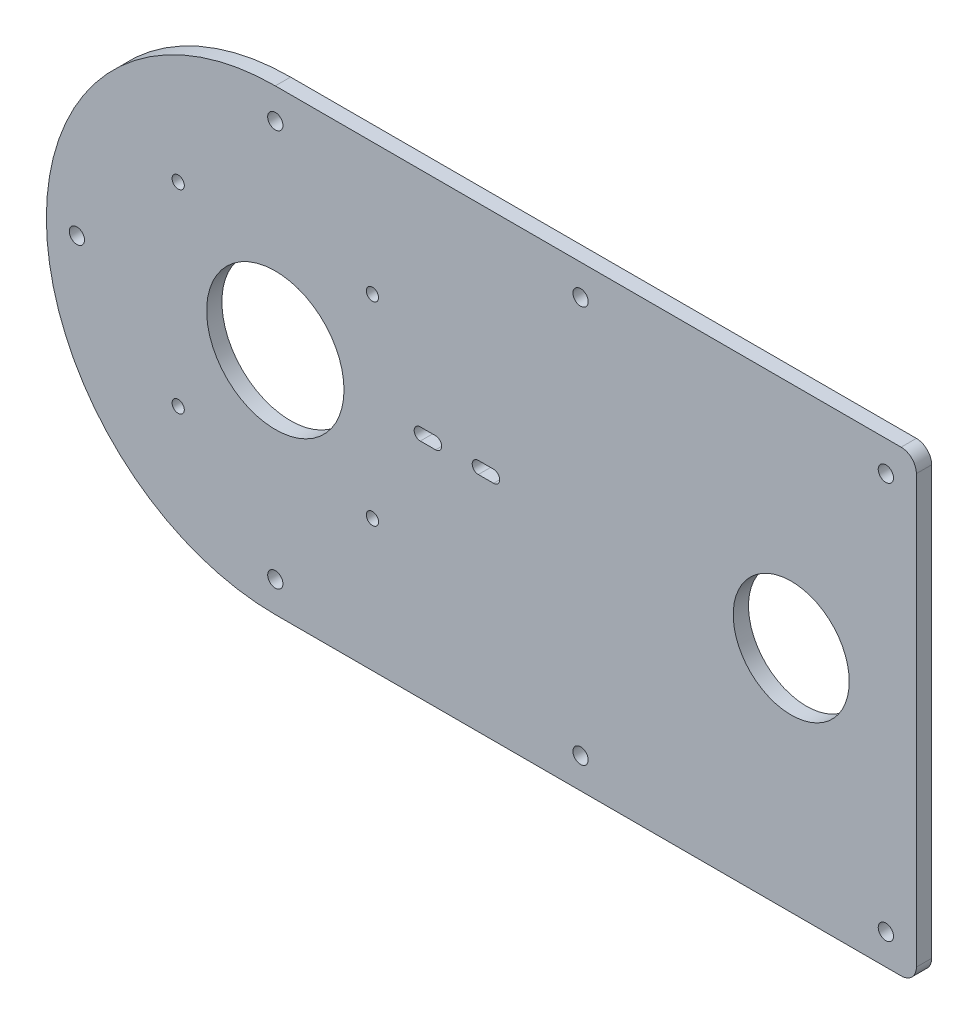
ISO-10303-21;
HEADER;
FILE_DESCRIPTION(('STEP AP214'),'2;1');
FILE_NAME('part.step','',(''),(''),'','','');
FILE_SCHEMA(('AUTOMOTIVE_DESIGN { 1 0 10303 214 1 1 1 1 }'));
ENDSEC;
DATA;
#1=APPLICATION_CONTEXT('core data for automotive mechanical design processes');
#2=APPLICATION_PROTOCOL_DEFINITION('international standard','automotive_design',2000,#1);
#3=PRODUCT_CONTEXT('',#1,'mechanical');
#4=PRODUCT('Part','Part','',(#3));
#5=PRODUCT_RELATED_PRODUCT_CATEGORY('part','',(#4));
#6=PRODUCT_DEFINITION_FORMATION('','',#4);
#7=PRODUCT_DEFINITION_CONTEXT('part definition',#1,'design');
#8=PRODUCT_DEFINITION('design','',#6,#7);
#9=PRODUCT_DEFINITION_SHAPE('','',#8);
#10=(LENGTH_UNIT() NAMED_UNIT(*) SI_UNIT(.MILLI.,.METRE.));
#11=(NAMED_UNIT(*) PLANE_ANGLE_UNIT() SI_UNIT($,.RADIAN.));
#12=(NAMED_UNIT(*) SI_UNIT($,.STERADIAN.) SOLID_ANGLE_UNIT());
#13=UNCERTAINTY_MEASURE_WITH_UNIT(LENGTH_MEASURE(1.E-05),#10,'distance_accuracy_value','');
#14=(GEOMETRIC_REPRESENTATION_CONTEXT(3) GLOBAL_UNCERTAINTY_ASSIGNED_CONTEXT((#13)) GLOBAL_UNIT_ASSIGNED_CONTEXT((#10,
#11,#12)) REPRESENTATION_CONTEXT('',''));
#15=CARTESIAN_POINT('',(0.,0.,0.));
#16=DIRECTION('',(0.,0.,1.));
#17=DIRECTION('',(1.,0.,0.));
#18=AXIS2_PLACEMENT_3D('',#15,#16,#17);
#19=CARTESIAN_POINT('',(30.0006920415225,17.5455264458724,5.));
#20=DIRECTION('',(0.,0.,1.));
#21=DIRECTION('',(1.,0.,0.));
#22=AXIS2_PLACEMENT_3D('',#19,#20,#21);
#23=PLANE('',#22);
#24=CARTESIAN_POINT('',(-1.81430795847747,-14.2694735541276,5.));
#25=DIRECTION('',(0.,0.,1.));
#26=DIRECTION('',(1.,0.,0.));
#27=AXIS2_PLACEMENT_3D('',#24,#25,#26);
#28=CIRCLE('',#27,2.);
#29=CARTESIAN_POINT('',(0.185692041522528,-14.2694735541276,5.));
#30=VERTEX_POINT('',#29);
#31=EDGE_CURVE('E399',#30,#30,#28,.T.);
#32=ORIENTED_EDGE('',*,*,#31,.F.);
#33=EDGE_LOOP('',(#32));
#34=FACE_BOUND('',#33,.T.);
#35=CARTESIAN_POINT('',(61.8156920415225,-14.2694735541276,5.));
#36=DIRECTION('',(0.,0.,1.));
#37=DIRECTION('',(1.,0.,0.));
#38=AXIS2_PLACEMENT_3D('',#35,#36,#37);
#39=CIRCLE('',#38,1.99999999999999);
#40=CARTESIAN_POINT('',(63.8156920415225,-14.2694735541276,5.));
#41=VERTEX_POINT('',#40);
#42=EDGE_CURVE('E411',#41,#41,#39,.T.);
#43=ORIENTED_EDGE('',*,*,#42,.F.);
#44=EDGE_LOOP('',(#43));
#45=FACE_BOUND('',#44,.T.);
#46=CARTESIAN_POINT('',(130.000692041523,82.5455264458725,5.));
#47=DIRECTION('',(0.,0.,1.));
#48=DIRECTION('',(1.,0.,0.));
#49=AXIS2_PLACEMENT_3D('',#46,#47,#48);
#50=CIRCLE('',#49,2.5);
#51=CARTESIAN_POINT('',(132.500692041523,82.5455264458725,5.));
#52=VERTEX_POINT('',#51);
#53=EDGE_CURVE('E423',#52,#52,#50,.T.);
#54=ORIENTED_EDGE('',*,*,#53,.F.);
#55=EDGE_LOOP('',(#54));
#56=FACE_BOUND('',#55,.T.);
#57=CARTESIAN_POINT('',(230.000692041523,-47.4544735541276,5.));
#58=DIRECTION('',(0.,0.,1.));
#59=DIRECTION('',(1.,0.,0.));
#60=AXIS2_PLACEMENT_3D('',#57,#58,#59);
#61=CIRCLE('',#60,2.5);
#62=CARTESIAN_POINT('',(232.500692041523,-47.4544735541276,5.));
#63=VERTEX_POINT('',#62);
#64=EDGE_CURVE('E435',#63,#63,#61,.T.);
#65=ORIENTED_EDGE('',*,*,#64,.F.);
#66=EDGE_LOOP('',(#65));
#67=FACE_BOUND('',#66,.T.);
#68=CARTESIAN_POINT('',(30.0006920415225,-47.4544735541276,5.));
#69=DIRECTION('',(0.,0.,1.));
#70=DIRECTION('',(1.,0.,0.));
#71=AXIS2_PLACEMENT_3D('',#68,#69,#70);
#72=CIRCLE('',#71,2.5);
#73=CARTESIAN_POINT('',(32.5006920415225,-47.4544735541276,5.));
#74=VERTEX_POINT('',#73);
#75=EDGE_CURVE('E162',#74,#74,#72,.T.);
#76=ORIENTED_EDGE('',*,*,#75,.F.);
#77=EDGE_LOOP('',(#76));
#78=FACE_BOUND('',#77,.T.);
#79=CARTESIAN_POINT('',(199.000692041523,17.5455264458725,5.));
#80=DIRECTION('',(0.,0.,1.));
#81=DIRECTION('',(1.,0.,0.));
#82=AXIS2_PLACEMENT_3D('',#79,#80,#81);
#83=CIRCLE('',#82,19.);
#84=CARTESIAN_POINT('',(218.000692041523,17.5455264458725,5.));
#85=VERTEX_POINT('',#84);
#86=EDGE_CURVE('E209',#85,#85,#83,.T.);
#87=ORIENTED_EDGE('',*,*,#86,.F.);
#88=EDGE_LOOP('',(#87));
#89=FACE_BOUND('',#88,.T.);
#90=CARTESIAN_POINT('',(30.0006920415225,17.5455264458724,5.));
#91=DIRECTION('',(0.,0.,1.));
#92=DIRECTION('',(1.,0.,0.));
#93=AXIS2_PLACEMENT_3D('',#90,#91,#92);
#94=CIRCLE('',#93,75.);
#95=CARTESIAN_POINT('',(30.0006920415225,92.5455264458725,5.));
#96=VERTEX_POINT('',#95);
#97=CARTESIAN_POINT('',(30.0006920415225,-57.4544735541275,5.));
#98=VERTEX_POINT('',#97);
#99=EDGE_CURVE('E221',#96,#98,#94,.T.);
#100=ORIENTED_EDGE('',*,*,#99,.T.);
#101=DIRECTION('',(1.,0.,0.));
#102=VECTOR('',#101,1.);
#103=CARTESIAN_POINT('',(30.0006920415225,-57.4544735541275,5.));
#104=LINE('',#103,#102);
#105=CARTESIAN_POINT('',(235.000692041522,-57.4544735541275,5.));
#106=VERTEX_POINT('',#105);
#107=EDGE_CURVE('E224',#98,#106,#104,.T.);
#108=ORIENTED_EDGE('',*,*,#107,.T.);
#109=CARTESIAN_POINT('',(235.000692041523,-52.4544735541275,5.));
#110=DIRECTION('',(0.,0.,1.));
#111=DIRECTION('',(1.,0.,0.));
#112=AXIS2_PLACEMENT_3D('',#109,#110,#111);
#113=CIRCLE('',#112,5.);
#114=CARTESIAN_POINT('',(240.000692041523,-52.4544735541275,5.));
#115=VERTEX_POINT('',#114);
#116=EDGE_CURVE('E227',#106,#115,#113,.T.);
#117=ORIENTED_EDGE('',*,*,#116,.T.);
#118=DIRECTION('',(0.,1.,0.));
#119=VECTOR('',#118,1.);
#120=CARTESIAN_POINT('',(240.000692041523,87.5455264458724,5.));
#121=LINE('',#120,#119);
#122=CARTESIAN_POINT('',(240.000692041523,87.5455264458724,5.));
#123=VERTEX_POINT('',#122);
#124=EDGE_CURVE('E229',#115,#123,#121,.T.);
#125=ORIENTED_EDGE('',*,*,#124,.T.);
#126=CARTESIAN_POINT('',(235.000692041523,87.5455264458725,5.));
#127=DIRECTION('',(0.,0.,1.));
#128=DIRECTION('',(-1.,0.,0.));
#129=AXIS2_PLACEMENT_3D('',#126,#127,#128);
#130=CIRCLE('',#129,5.);
#131=CARTESIAN_POINT('',(235.000692041522,92.5455264458725,5.));
#132=VERTEX_POINT('',#131);
#133=EDGE_CURVE('E231',#123,#132,#130,.T.);
#134=ORIENTED_EDGE('',*,*,#133,.T.);
#135=DIRECTION('',(-1.,0.,0.));
#136=VECTOR('',#135,1.);
#137=CARTESIAN_POINT('',(30.0006920415225,92.5455264458725,5.));
#138=LINE('',#137,#136);
#139=EDGE_CURVE('E233',#132,#96,#138,.T.);
#140=ORIENTED_EDGE('',*,*,#139,.T.);
#141=EDGE_LOOP('',(#100,#108,#117,#125,#134,#140));
#142=FACE_BOUND('',#141,.T.);
#143=CARTESIAN_POINT('',(-34.9993079584775,17.5455264458724,5.));
#144=DIRECTION('',(0.,0.,1.));
#145=DIRECTION('',(1.,0.,0.));
#146=AXIS2_PLACEMENT_3D('',#143,#144,#145);
#147=CIRCLE('',#146,2.5);
#148=CARTESIAN_POINT('',(-32.4993079584775,17.5455264458724,5.));
#149=VERTEX_POINT('',#148);
#150=EDGE_CURVE('E215',#149,#149,#147,.T.);
#151=ORIENTED_EDGE('',*,*,#150,.F.);
#152=EDGE_LOOP('',(#151));
#153=FACE_BOUND('',#152,.T.);
#154=CARTESIAN_POINT('',(30.0006920415225,17.5455264458724,5.));
#155=DIRECTION('',(0.,0.,1.));
#156=DIRECTION('',(1.,0.,0.));
#157=AXIS2_PLACEMENT_3D('',#154,#155,#156);
#158=CIRCLE('',#157,22.5);
#159=CARTESIAN_POINT('',(52.5006920415225,17.5455264458724,5.));
#160=VERTEX_POINT('',#159);
#161=EDGE_CURVE('E203',#160,#160,#158,.T.);
#162=ORIENTED_EDGE('',*,*,#161,.F.);
#163=EDGE_LOOP('',(#162));
#164=FACE_BOUND('',#163,.T.);
#165=DIRECTION('',(1.,0.,0.));
#166=VECTOR('',#165,1.);
#167=CARTESIAN_POINT('',(77.5006920415225,15.5455264458725,5.));
#168=LINE('',#167,#166);
#169=CARTESIAN_POINT('',(77.5006920415225,15.5455264458725,5.));
#170=VERTEX_POINT('',#169);
#171=CARTESIAN_POINT('',(82.5006920415225,15.5455264458725,5.));
#172=VERTEX_POINT('',#171);
#173=EDGE_CURVE('E174',#170,#172,#168,.T.);
#174=ORIENTED_EDGE('',*,*,#173,.F.);
#175=CARTESIAN_POINT('',(77.5006920415225,17.5455264458725,5.));
#176=DIRECTION('',(0.,0.,1.));
#177=DIRECTION('',(1.,0.,0.));
#178=AXIS2_PLACEMENT_3D('',#175,#176,#177);
#179=CIRCLE('',#178,2.);
#180=CARTESIAN_POINT('',(77.5006920415225,19.5455264458725,5.));
#181=VERTEX_POINT('',#180);
#182=EDGE_CURVE('E172',#181,#170,#179,.T.);
#183=ORIENTED_EDGE('',*,*,#182,.F.);
#184=DIRECTION('',(-1.,0.,0.));
#185=VECTOR('',#184,1.);
#186=CARTESIAN_POINT('',(77.5006920415225,19.5455264458725,5.));
#187=LINE('',#186,#185);
#188=CARTESIAN_POINT('',(82.5006920415225,19.5455264458725,5.));
#189=VERTEX_POINT('',#188);
#190=EDGE_CURVE('E180',#189,#181,#187,.T.);
#191=ORIENTED_EDGE('',*,*,#190,.F.);
#192=CARTESIAN_POINT('',(82.5006920415225,17.5455264458725,5.));
#193=DIRECTION('',(0.,0.,1.));
#194=DIRECTION('',(1.,0.,0.));
#195=AXIS2_PLACEMENT_3D('',#192,#193,#194);
#196=CIRCLE('',#195,2.);
#197=EDGE_CURVE('E177',#172,#189,#196,.T.);
#198=ORIENTED_EDGE('',*,*,#197,.F.);
#199=EDGE_LOOP('',(#174,#183,#191,#198));
#200=FACE_BOUND('',#199,.T.);
#201=DIRECTION('',(-1.,0.,0.));
#202=VECTOR('',#201,1.);
#203=CARTESIAN_POINT('',(101.500692041523,19.5455264458725,5.));
#204=LINE('',#203,#202);
#205=CARTESIAN_POINT('',(101.500692041523,19.5455264458725,5.));
#206=VERTEX_POINT('',#205);
#207=CARTESIAN_POINT('',(96.5006920415225,19.5455264458725,5.));
#208=VERTEX_POINT('',#207);
#209=EDGE_CURVE('E141',#206,#208,#204,.T.);
#210=ORIENTED_EDGE('',*,*,#209,.F.);
#211=CARTESIAN_POINT('',(101.500692041523,17.5455264458725,5.));
#212=DIRECTION('',(0.,0.,1.));
#213=DIRECTION('',(1.,0.,0.));
#214=AXIS2_PLACEMENT_3D('',#211,#212,#213);
#215=CIRCLE('',#214,2.);
#216=CARTESIAN_POINT('',(101.500692041523,15.5455264458725,5.));
#217=VERTEX_POINT('',#216);
#218=EDGE_CURVE('E133',#217,#206,#215,.T.);
#219=ORIENTED_EDGE('',*,*,#218,.F.);
#220=DIRECTION('',(1.,0.,0.));
#221=VECTOR('',#220,1.);
#222=CARTESIAN_POINT('',(101.500692041523,15.5455264458725,5.));
#223=LINE('',#222,#221);
#224=CARTESIAN_POINT('',(96.5006920415225,15.5455264458725,5.));
#225=VERTEX_POINT('',#224);
#226=EDGE_CURVE('E156',#225,#217,#223,.T.);
#227=ORIENTED_EDGE('',*,*,#226,.F.);
#228=CARTESIAN_POINT('',(96.5006920415225,17.5455264458725,5.));
#229=DIRECTION('',(0.,0.,1.));
#230=DIRECTION('',(1.,0.,0.));
#231=AXIS2_PLACEMENT_3D('',#228,#229,#230);
#232=CIRCLE('',#231,2.);
#233=EDGE_CURVE('E154',#208,#225,#232,.T.);
#234=ORIENTED_EDGE('',*,*,#233,.F.);
#235=EDGE_LOOP('',(#210,#219,#227,#234));
#236=FACE_BOUND('',#235,.T.);
#237=CARTESIAN_POINT('',(30.0006920415225,82.5455264458725,5.));
#238=DIRECTION('',(0.,0.,1.));
#239=DIRECTION('',(1.,0.,0.));
#240=AXIS2_PLACEMENT_3D('',#237,#238,#239);
#241=CIRCLE('',#240,2.5);
#242=CARTESIAN_POINT('',(32.5006920415225,82.5455264458725,5.));
#243=VERTEX_POINT('',#242);
#244=EDGE_CURVE('E441',#243,#243,#241,.T.);
#245=ORIENTED_EDGE('',*,*,#244,.F.);
#246=EDGE_LOOP('',(#245));
#247=FACE_BOUND('',#246,.T.);
#248=CARTESIAN_POINT('',(230.000692041523,82.5455264458725,5.));
#249=DIRECTION('',(0.,0.,1.));
#250=DIRECTION('',(1.,0.,0.));
#251=AXIS2_PLACEMENT_3D('',#248,#249,#250);
#252=CIRCLE('',#251,2.5);
#253=CARTESIAN_POINT('',(232.500692041523,82.5455264458725,5.));
#254=VERTEX_POINT('',#253);
#255=EDGE_CURVE('E429',#254,#254,#252,.T.);
#256=ORIENTED_EDGE('',*,*,#255,.F.);
#257=EDGE_LOOP('',(#256));
#258=FACE_BOUND('',#257,.T.);
#259=CARTESIAN_POINT('',(130.000692041523,-47.4544735541276,5.));
#260=DIRECTION('',(0.,0.,1.));
#261=DIRECTION('',(1.,0.,0.));
#262=AXIS2_PLACEMENT_3D('',#259,#260,#261);
#263=CIRCLE('',#262,2.5);
#264=CARTESIAN_POINT('',(132.500692041523,-47.4544735541276,5.));
#265=VERTEX_POINT('',#264);
#266=EDGE_CURVE('E417',#265,#265,#263,.T.);
#267=ORIENTED_EDGE('',*,*,#266,.F.);
#268=EDGE_LOOP('',(#267));
#269=FACE_BOUND('',#268,.T.);
#270=CARTESIAN_POINT('',(61.8156920415225,49.3605264458724,5.));
#271=DIRECTION('',(0.,0.,1.));
#272=DIRECTION('',(1.,0.,0.));
#273=AXIS2_PLACEMENT_3D('',#270,#271,#272);
#274=CIRCLE('',#273,1.99999999999999);
#275=CARTESIAN_POINT('',(63.8156920415225,49.3605264458724,5.));
#276=VERTEX_POINT('',#275);
#277=EDGE_CURVE('E405',#276,#276,#274,.T.);
#278=ORIENTED_EDGE('',*,*,#277,.F.);
#279=EDGE_LOOP('',(#278));
#280=FACE_BOUND('',#279,.T.);
#281=CARTESIAN_POINT('',(-1.81430795847747,49.3605264458724,5.));
#282=DIRECTION('',(0.,0.,1.));
#283=DIRECTION('',(1.,0.,0.));
#284=AXIS2_PLACEMENT_3D('',#281,#282,#283);
#285=CIRCLE('',#284,2.);
#286=CARTESIAN_POINT('',(0.185692041522529,49.3605264458724,5.));
#287=VERTEX_POINT('',#286);
#288=EDGE_CURVE('E390',#287,#287,#285,.T.);
#289=ORIENTED_EDGE('',*,*,#288,.F.);
#290=EDGE_LOOP('',(#289));
#291=FACE_BOUND('',#290,.T.);
#292=ADVANCED_FACE('F32',(#34,#45,#56,#67,#78,#89,#142,#153,#164,#200,#236,#247,#258,#269,#280,
#291),#23,.T.);
#293=CARTESIAN_POINT('',(30.0006920415225,17.5455264458724,0.));
#294=DIRECTION('',(0.,0.,1.));
#295=DIRECTION('',(1.,0.,0.));
#296=AXIS2_PLACEMENT_3D('',#293,#294,#295);
#297=PLANE('',#296);
#298=CARTESIAN_POINT('',(77.5006920415225,17.5455264458725,0.));
#299=DIRECTION('',(0.,0.,1.));
#300=DIRECTION('',(1.,0.,0.));
#301=AXIS2_PLACEMENT_3D('',#298,#299,#300);
#302=CIRCLE('',#301,2.);
#303=CARTESIAN_POINT('',(77.5006920415225,19.5455264458725,0.));
#304=VERTEX_POINT('',#303);
#305=CARTESIAN_POINT('',(77.5006920415225,15.5455264458725,0.));
#306=VERTEX_POINT('',#305);
#307=EDGE_CURVE('E149',#304,#306,#302,.T.);
#308=ORIENTED_EDGE('',*,*,#307,.T.);
#309=DIRECTION('',(1.,0.,0.));
#310=VECTOR('',#309,1.);
#311=CARTESIAN_POINT('',(77.5006920415225,15.5455264458725,0.));
#312=LINE('',#311,#310);
#313=CARTESIAN_POINT('',(82.5006920415225,15.5455264458725,0.));
#314=VERTEX_POINT('',#313);
#315=EDGE_CURVE('E185',#306,#314,#312,.T.);
#316=ORIENTED_EDGE('',*,*,#315,.T.);
#317=CARTESIAN_POINT('',(82.5006920415225,17.5455264458725,0.));
#318=DIRECTION('',(0.,0.,1.));
#319=DIRECTION('',(1.,0.,0.));
#320=AXIS2_PLACEMENT_3D('',#317,#318,#319);
#321=CIRCLE('',#320,2.);
#322=CARTESIAN_POINT('',(82.5006920415225,19.5455264458725,0.));
#323=VERTEX_POINT('',#322);
#324=EDGE_CURVE('E188',#314,#323,#321,.T.);
#325=ORIENTED_EDGE('',*,*,#324,.T.);
#326=DIRECTION('',(-1.,0.,0.));
#327=VECTOR('',#326,1.);
#328=CARTESIAN_POINT('',(77.5006920415225,19.5455264458725,0.));
#329=LINE('',#328,#327);
#330=EDGE_CURVE('E175',#323,#304,#329,.T.);
#331=ORIENTED_EDGE('',*,*,#330,.T.);
#332=EDGE_LOOP('',(#308,#316,#325,#331));
#333=FACE_BOUND('',#332,.T.);
#334=CARTESIAN_POINT('',(30.0006920415225,17.5455264458724,0.));
#335=DIRECTION('',(0.,0.,1.));
#336=DIRECTION('',(1.,0.,0.));
#337=AXIS2_PLACEMENT_3D('',#334,#335,#336);
#338=CIRCLE('',#337,75.);
#339=CARTESIAN_POINT('',(30.0006920415225,92.5455264458725,0.));
#340=VERTEX_POINT('',#339);
#341=CARTESIAN_POINT('',(30.0006920415225,-57.4544735541275,0.));
#342=VERTEX_POINT('',#341);
#343=EDGE_CURVE('E218',#340,#342,#338,.T.);
#344=ORIENTED_EDGE('',*,*,#343,.F.);
#345=DIRECTION('',(-1.,0.,0.));
#346=VECTOR('',#345,1.);
#347=CARTESIAN_POINT('',(30.0006920415225,92.5455264458725,0.));
#348=LINE('',#347,#346);
#349=CARTESIAN_POINT('',(235.000692041522,92.5455264458725,0.));
#350=VERTEX_POINT('',#349);
#351=EDGE_CURVE('E225',#350,#340,#348,.T.);
#352=ORIENTED_EDGE('',*,*,#351,.F.);
#353=CARTESIAN_POINT('',(235.000692041523,87.5455264458725,0.));
#354=DIRECTION('',(0.,0.,1.));
#355=DIRECTION('',(-1.,0.,0.));
#356=AXIS2_PLACEMENT_3D('',#353,#354,#355);
#357=CIRCLE('',#356,5.);
#358=CARTESIAN_POINT('',(240.000692041523,87.5455264458724,0.));
#359=VERTEX_POINT('',#358);
#360=EDGE_CURVE('E244',#359,#350,#357,.T.);
#361=ORIENTED_EDGE('',*,*,#360,.F.);
#362=DIRECTION('',(0.,1.,0.));
#363=VECTOR('',#362,1.);
#364=CARTESIAN_POINT('',(240.000692041523,87.5455264458724,0.));
#365=LINE('',#364,#363);
#366=CARTESIAN_POINT('',(240.000692041523,-52.4544735541275,0.));
#367=VERTEX_POINT('',#366);
#368=EDGE_CURVE('E242',#367,#359,#365,.T.);
#369=ORIENTED_EDGE('',*,*,#368,.F.);
#370=CARTESIAN_POINT('',(235.000692041523,-52.4544735541275,0.));
#371=DIRECTION('',(0.,0.,1.));
#372=DIRECTION('',(1.,0.,0.));
#373=AXIS2_PLACEMENT_3D('',#370,#371,#372);
#374=CIRCLE('',#373,5.);
#375=CARTESIAN_POINT('',(235.000692041522,-57.4544735541275,0.));
#376=VERTEX_POINT('',#375);
#377=EDGE_CURVE('E240',#376,#367,#374,.T.);
#378=ORIENTED_EDGE('',*,*,#377,.F.);
#379=DIRECTION('',(1.,0.,0.));
#380=VECTOR('',#379,1.);
#381=CARTESIAN_POINT('',(30.0006920415225,-57.4544735541275,0.));
#382=LINE('',#381,#380);
#383=EDGE_CURVE('E238',#342,#376,#382,.T.);
#384=ORIENTED_EDGE('',*,*,#383,.F.);
#385=EDGE_LOOP('',(#344,#352,#361,#369,#378,#384));
#386=FACE_BOUND('',#385,.T.);
#387=CARTESIAN_POINT('',(-34.9993079584775,17.5455264458724,0.));
#388=DIRECTION('',(0.,0.,1.));
#389=DIRECTION('',(1.,0.,0.));
#390=AXIS2_PLACEMENT_3D('',#387,#388,#389);
#391=CIRCLE('',#390,2.5);
#392=CARTESIAN_POINT('',(-32.4993079584775,17.5455264458724,0.));
#393=VERTEX_POINT('',#392);
#394=EDGE_CURVE('E212',#393,#393,#391,.T.);
#395=ORIENTED_EDGE('',*,*,#394,.T.);
#396=EDGE_LOOP('',(#395));
#397=FACE_BOUND('',#396,.T.);
#398=CARTESIAN_POINT('',(199.000692041523,17.5455264458725,0.));
#399=DIRECTION('',(0.,0.,1.));
#400=DIRECTION('',(1.,0.,0.));
#401=AXIS2_PLACEMENT_3D('',#398,#399,#400);
#402=CIRCLE('',#401,19.);
#403=CARTESIAN_POINT('',(218.000692041523,17.5455264458725,0.));
#404=VERTEX_POINT('',#403);
#405=EDGE_CURVE('E206',#404,#404,#402,.T.);
#406=ORIENTED_EDGE('',*,*,#405,.T.);
#407=EDGE_LOOP('',(#406));
#408=FACE_BOUND('',#407,.T.);
#409=CARTESIAN_POINT('',(30.0006920415225,17.5455264458724,0.));
#410=DIRECTION('',(0.,0.,1.));
#411=DIRECTION('',(1.,0.,0.));
#412=AXIS2_PLACEMENT_3D('',#409,#410,#411);
#413=CIRCLE('',#412,22.5);
#414=CARTESIAN_POINT('',(52.5006920415225,17.5455264458724,0.));
#415=VERTEX_POINT('',#414);
#416=EDGE_CURVE('E202',#415,#415,#413,.T.);
#417=ORIENTED_EDGE('',*,*,#416,.T.);
#418=EDGE_LOOP('',(#417));
#419=FACE_BOUND('',#418,.T.);
#420=CARTESIAN_POINT('',(101.500692041523,17.5455264458725,0.));
#421=DIRECTION('',(0.,0.,1.));
#422=DIRECTION('',(1.,0.,0.));
#423=AXIS2_PLACEMENT_3D('',#420,#421,#422);
#424=CIRCLE('',#423,2.);
#425=CARTESIAN_POINT('',(101.500692041523,15.5455264458725,0.));
#426=VERTEX_POINT('',#425);
#427=CARTESIAN_POINT('',(101.500692041523,19.5455264458725,0.));
#428=VERTEX_POINT('',#427);
#429=EDGE_CURVE('E55',#426,#428,#424,.T.);
#430=ORIENTED_EDGE('',*,*,#429,.T.);
#431=DIRECTION('',(-1.,0.,0.));
#432=VECTOR('',#431,1.);
#433=CARTESIAN_POINT('',(101.500692041523,19.5455264458725,0.));
#434=LINE('',#433,#432);
#435=CARTESIAN_POINT('',(96.5006920415225,19.5455264458725,0.));
#436=VERTEX_POINT('',#435);
#437=EDGE_CURVE('E148',#428,#436,#434,.T.);
#438=ORIENTED_EDGE('',*,*,#437,.T.);
#439=CARTESIAN_POINT('',(96.5006920415225,17.5455264458725,0.));
#440=DIRECTION('',(0.,0.,1.));
#441=DIRECTION('',(1.,0.,0.));
#442=AXIS2_PLACEMENT_3D('',#439,#440,#441);
#443=CIRCLE('',#442,2.);
#444=CARTESIAN_POINT('',(96.5006920415225,15.5455264458725,0.));
#445=VERTEX_POINT('',#444);
#446=EDGE_CURVE('E164',#436,#445,#443,.T.);
#447=ORIENTED_EDGE('',*,*,#446,.T.);
#448=DIRECTION('',(1.,0.,0.));
#449=VECTOR('',#448,1.);
#450=CARTESIAN_POINT('',(101.500692041523,15.5455264458725,0.));
#451=LINE('',#450,#449);
#452=EDGE_CURVE('E142',#445,#426,#451,.T.);
#453=ORIENTED_EDGE('',*,*,#452,.T.);
#454=EDGE_LOOP('',(#430,#438,#447,#453));
#455=FACE_BOUND('',#454,.T.);
#456=CARTESIAN_POINT('',(30.0006920415225,-47.4544735541276,0.));
#457=DIRECTION('',(0.,0.,1.));
#458=DIRECTION('',(1.,0.,0.));
#459=AXIS2_PLACEMENT_3D('',#456,#457,#458);
#460=CIRCLE('',#459,2.5);
#461=CARTESIAN_POINT('',(32.5006920415225,-47.4544735541276,0.));
#462=VERTEX_POINT('',#461);
#463=EDGE_CURVE('E444',#462,#462,#460,.T.);
#464=ORIENTED_EDGE('',*,*,#463,.T.);
#465=EDGE_LOOP('',(#464));
#466=FACE_BOUND('',#465,.T.);
#467=CARTESIAN_POINT('',(30.0006920415225,82.5455264458725,0.));
#468=DIRECTION('',(0.,0.,1.));
#469=DIRECTION('',(1.,0.,0.));
#470=AXIS2_PLACEMENT_3D('',#467,#468,#469);
#471=CIRCLE('',#470,2.5);
#472=CARTESIAN_POINT('',(32.5006920415225,82.5455264458725,0.));
#473=VERTEX_POINT('',#472);
#474=EDGE_CURVE('E438',#473,#473,#471,.T.);
#475=ORIENTED_EDGE('',*,*,#474,.T.);
#476=EDGE_LOOP('',(#475));
#477=FACE_BOUND('',#476,.T.);
#478=CARTESIAN_POINT('',(230.000692041523,-47.4544735541276,0.));
#479=DIRECTION('',(0.,0.,1.));
#480=DIRECTION('',(1.,0.,0.));
#481=AXIS2_PLACEMENT_3D('',#478,#479,#480);
#482=CIRCLE('',#481,2.5);
#483=CARTESIAN_POINT('',(232.500692041523,-47.4544735541276,0.));
#484=VERTEX_POINT('',#483);
#485=EDGE_CURVE('E432',#484,#484,#482,.T.);
#486=ORIENTED_EDGE('',*,*,#485,.T.);
#487=EDGE_LOOP('',(#486));
#488=FACE_BOUND('',#487,.T.);
#489=CARTESIAN_POINT('',(230.000692041523,82.5455264458725,0.));
#490=DIRECTION('',(0.,0.,1.));
#491=DIRECTION('',(1.,0.,0.));
#492=AXIS2_PLACEMENT_3D('',#489,#490,#491);
#493=CIRCLE('',#492,2.5);
#494=CARTESIAN_POINT('',(232.500692041523,82.5455264458725,0.));
#495=VERTEX_POINT('',#494);
#496=EDGE_CURVE('E426',#495,#495,#493,.T.);
#497=ORIENTED_EDGE('',*,*,#496,.T.);
#498=EDGE_LOOP('',(#497));
#499=FACE_BOUND('',#498,.T.);
#500=CARTESIAN_POINT('',(130.000692041523,82.5455264458725,0.));
#501=DIRECTION('',(0.,0.,1.));
#502=DIRECTION('',(1.,0.,0.));
#503=AXIS2_PLACEMENT_3D('',#500,#501,#502);
#504=CIRCLE('',#503,2.5);
#505=CARTESIAN_POINT('',(132.500692041523,82.5455264458725,0.));
#506=VERTEX_POINT('',#505);
#507=EDGE_CURVE('E420',#506,#506,#504,.T.);
#508=ORIENTED_EDGE('',*,*,#507,.T.);
#509=EDGE_LOOP('',(#508));
#510=FACE_BOUND('',#509,.T.);
#511=CARTESIAN_POINT('',(130.000692041523,-47.4544735541276,0.));
#512=DIRECTION('',(0.,0.,1.));
#513=DIRECTION('',(1.,0.,0.));
#514=AXIS2_PLACEMENT_3D('',#511,#512,#513);
#515=CIRCLE('',#514,2.5);
#516=CARTESIAN_POINT('',(132.500692041523,-47.4544735541276,0.));
#517=VERTEX_POINT('',#516);
#518=EDGE_CURVE('E414',#517,#517,#515,.T.);
#519=ORIENTED_EDGE('',*,*,#518,.T.);
#520=EDGE_LOOP('',(#519));
#521=FACE_BOUND('',#520,.T.);
#522=CARTESIAN_POINT('',(61.8156920415225,-14.2694735541276,0.));
#523=DIRECTION('',(0.,0.,1.));
#524=DIRECTION('',(1.,0.,0.));
#525=AXIS2_PLACEMENT_3D('',#522,#523,#524);
#526=CIRCLE('',#525,1.99999999999999);
#527=CARTESIAN_POINT('',(63.8156920415225,-14.2694735541276,0.));
#528=VERTEX_POINT('',#527);
#529=EDGE_CURVE('E408',#528,#528,#526,.T.);
#530=ORIENTED_EDGE('',*,*,#529,.T.);
#531=EDGE_LOOP('',(#530));
#532=FACE_BOUND('',#531,.T.);
#533=CARTESIAN_POINT('',(61.8156920415225,49.3605264458724,0.));
#534=DIRECTION('',(0.,0.,1.));
#535=DIRECTION('',(1.,0.,0.));
#536=AXIS2_PLACEMENT_3D('',#533,#534,#535);
#537=CIRCLE('',#536,1.99999999999999);
#538=CARTESIAN_POINT('',(63.8156920415225,49.3605264458724,0.));
#539=VERTEX_POINT('',#538);
#540=EDGE_CURVE('E402',#539,#539,#537,.T.);
#541=ORIENTED_EDGE('',*,*,#540,.T.);
#542=EDGE_LOOP('',(#541));
#543=FACE_BOUND('',#542,.T.);
#544=CARTESIAN_POINT('',(-1.81430795847747,-14.2694735541276,0.));
#545=DIRECTION('',(0.,0.,1.));
#546=DIRECTION('',(1.,0.,0.));
#547=AXIS2_PLACEMENT_3D('',#544,#545,#546);
#548=CIRCLE('',#547,2.);
#549=CARTESIAN_POINT('',(0.185692041522528,-14.2694735541276,0.));
#550=VERTEX_POINT('',#549);
#551=EDGE_CURVE('E396',#550,#550,#548,.T.);
#552=ORIENTED_EDGE('',*,*,#551,.T.);
#553=EDGE_LOOP('',(#552));
#554=FACE_BOUND('',#553,.T.);
#555=CARTESIAN_POINT('',(-1.81430795847747,49.3605264458724,0.));
#556=DIRECTION('',(0.,0.,1.));
#557=DIRECTION('',(1.,0.,0.));
#558=AXIS2_PLACEMENT_3D('',#555,#556,#557);
#559=CIRCLE('',#558,2.);
#560=CARTESIAN_POINT('',(0.185692041522529,49.3605264458724,0.));
#561=VERTEX_POINT('',#560);
#562=EDGE_CURVE('E393',#561,#561,#559,.T.);
#563=ORIENTED_EDGE('',*,*,#562,.T.);
#564=EDGE_LOOP('',(#563));
#565=FACE_BOUND('',#564,.T.);
#566=ADVANCED_FACE('F268',(#333,#386,#397,#408,#419,#455,#466,#477,#488,#499,#510,#521,#532,
#543,#554,#565),#297,.F.);
#567=CARTESIAN_POINT('',(30.0006920415225,17.5455264458724,5.));
#568=DIRECTION('',(0.,0.,-1.));
#569=DIRECTION('',(-1.,0.,0.));
#570=AXIS2_PLACEMENT_3D('',#567,#568,#569);
#571=CYLINDRICAL_SURFACE('',#570,75.);
#572=ORIENTED_EDGE('',*,*,#343,.T.);
#573=DIRECTION('',(0.,0.,-1.));
#574=VECTOR('',#573,1.);
#575=CARTESIAN_POINT('',(30.0006920415225,-57.4544735541275,5.));
#576=LINE('',#575,#574);
#577=EDGE_CURVE('E11',#98,#342,#576,.T.);
#578=ORIENTED_EDGE('',*,*,#577,.F.);
#579=ORIENTED_EDGE('',*,*,#99,.F.);
#580=DIRECTION('',(0.,0.,-1.));
#581=VECTOR('',#580,1.);
#582=CARTESIAN_POINT('',(30.0006920415225,92.5455264458725,5.));
#583=LINE('',#582,#581);
#584=EDGE_CURVE('E235',#96,#340,#583,.T.);
#585=ORIENTED_EDGE('',*,*,#584,.T.);
#586=EDGE_LOOP('',(#572,#578,#579,#585));
#587=FACE_BOUND('',#586,.T.);
#588=ADVANCED_FACE('F34',(#587),#571,.T.);
#589=CARTESIAN_POINT('',(30.0006920415225,-57.4544735541275,5.));
#590=DIRECTION('',(0.,1.,0.));
#591=DIRECTION('',(0.,0.,1.));
#592=AXIS2_PLACEMENT_3D('',#589,#590,#591);
#593=PLANE('',#592);
#594=ORIENTED_EDGE('',*,*,#383,.T.);
#595=DIRECTION('',(0.,0.,-1.));
#596=VECTOR('',#595,1.);
#597=CARTESIAN_POINT('',(235.000692041522,-57.4544735541275,5.));
#598=LINE('',#597,#596);
#599=EDGE_CURVE('E40',#106,#376,#598,.T.);
#600=ORIENTED_EDGE('',*,*,#599,.F.);
#601=ORIENTED_EDGE('',*,*,#107,.F.);
#602=ORIENTED_EDGE('',*,*,#577,.T.);
#603=EDGE_LOOP('',(#594,#600,#601,#602));
#604=FACE_BOUND('',#603,.T.);
#605=ADVANCED_FACE('F286',(#604),#593,.F.);
#606=CARTESIAN_POINT('',(235.000692041523,-52.4544735541275,5.));
#607=DIRECTION('',(0.,0.,-1.));
#608=DIRECTION('',(-1.,0.,0.));
#609=AXIS2_PLACEMENT_3D('',#606,#607,#608);
#610=CYLINDRICAL_SURFACE('',#609,5.);
#611=ORIENTED_EDGE('',*,*,#377,.T.);
#612=DIRECTION('',(0.,0.,-1.));
#613=VECTOR('',#612,1.);
#614=CARTESIAN_POINT('',(240.000692041523,-52.4544735541275,5.));
#615=LINE('',#614,#613);
#616=EDGE_CURVE('E255',#115,#367,#615,.T.);
#617=ORIENTED_EDGE('',*,*,#616,.F.);
#618=ORIENTED_EDGE('',*,*,#116,.F.);
#619=ORIENTED_EDGE('',*,*,#599,.T.);
#620=EDGE_LOOP('',(#611,#617,#618,#619));
#621=FACE_BOUND('',#620,.T.);
#622=ADVANCED_FACE('F262',(#621),#610,.T.);
#623=CARTESIAN_POINT('',(240.000692041523,87.5455264458724,5.));
#624=DIRECTION('',(-1.,0.,0.));
#625=DIRECTION('',(0.,0.,1.));
#626=AXIS2_PLACEMENT_3D('',#623,#624,#625);
#627=PLANE('',#626);
#628=ORIENTED_EDGE('',*,*,#368,.T.);
#629=DIRECTION('',(0.,0.,-1.));
#630=VECTOR('',#629,1.);
#631=CARTESIAN_POINT('',(240.000692041523,87.5455264458724,5.));
#632=LINE('',#631,#630);
#633=EDGE_CURVE('E252',#123,#359,#632,.T.);
#634=ORIENTED_EDGE('',*,*,#633,.F.);
#635=ORIENTED_EDGE('',*,*,#124,.F.);
#636=ORIENTED_EDGE('',*,*,#616,.T.);
#637=EDGE_LOOP('',(#628,#634,#635,#636));
#638=FACE_BOUND('',#637,.T.);
#639=ADVANCED_FACE('F274',(#638),#627,.F.);
#640=CARTESIAN_POINT('',(235.000692041523,87.5455264458725,5.));
#641=DIRECTION('',(0.,0.,-1.));
#642=DIRECTION('',(-1.,0.,0.));
#643=AXIS2_PLACEMENT_3D('',#640,#641,#642);
#644=CYLINDRICAL_SURFACE('',#643,5.);
#645=ORIENTED_EDGE('',*,*,#360,.T.);
#646=DIRECTION('',(0.,0.,-1.));
#647=VECTOR('',#646,1.);
#648=CARTESIAN_POINT('',(235.000692041522,92.5455264458725,5.));
#649=LINE('',#648,#647);
#650=EDGE_CURVE('E249',#132,#350,#649,.T.);
#651=ORIENTED_EDGE('',*,*,#650,.F.);
#652=ORIENTED_EDGE('',*,*,#133,.F.);
#653=ORIENTED_EDGE('',*,*,#633,.T.);
#654=EDGE_LOOP('',(#645,#651,#652,#653));
#655=FACE_BOUND('',#654,.T.);
#656=ADVANCED_FACE('F278',(#655),#644,.T.);
#657=CARTESIAN_POINT('',(30.0006920415225,92.5455264458725,5.));
#658=DIRECTION('',(0.,-1.,0.));
#659=DIRECTION('',(0.,0.,-1.));
#660=AXIS2_PLACEMENT_3D('',#657,#658,#659);
#661=PLANE('',#660);
#662=ORIENTED_EDGE('',*,*,#351,.T.);
#663=ORIENTED_EDGE('',*,*,#584,.F.);
#664=ORIENTED_EDGE('',*,*,#139,.F.);
#665=ORIENTED_EDGE('',*,*,#650,.T.);
#666=EDGE_LOOP('',(#662,#663,#664,#665));
#667=FACE_BOUND('',#666,.T.);
#668=ADVANCED_FACE('F289',(#667),#661,.F.);
#669=CARTESIAN_POINT('',(-34.9993079584775,17.5455264458724,5.));
#670=DIRECTION('',(0.,0.,-1.));
#671=DIRECTION('',(-1.,0.,0.));
#672=AXIS2_PLACEMENT_3D('',#669,#670,#671);
#673=CYLINDRICAL_SURFACE('',#672,2.5);
#674=ORIENTED_EDGE('',*,*,#150,.T.);
#675=EDGE_LOOP('',(#674));
#676=FACE_BOUND('',#675,.T.);
#677=ORIENTED_EDGE('',*,*,#394,.F.);
#678=EDGE_LOOP('',(#677));
#679=FACE_BOUND('',#678,.T.);
#680=ADVANCED_FACE('F291',(#676,#679),#673,.F.);
#681=CARTESIAN_POINT('',(199.000692041523,17.5455264458725,5.));
#682=DIRECTION('',(0.,0.,-1.));
#683=DIRECTION('',(-1.,0.,0.));
#684=AXIS2_PLACEMENT_3D('',#681,#682,#683);
#685=CYLINDRICAL_SURFACE('',#684,19.);
#686=ORIENTED_EDGE('',*,*,#86,.T.);
#687=EDGE_LOOP('',(#686));
#688=FACE_BOUND('',#687,.T.);
#689=ORIENTED_EDGE('',*,*,#405,.F.);
#690=EDGE_LOOP('',(#689));
#691=FACE_BOUND('',#690,.T.);
#692=ADVANCED_FACE('F297',(#688,#691),#685,.F.);
#693=CARTESIAN_POINT('',(30.0006920415225,17.5455264458724,5.));
#694=DIRECTION('',(0.,0.,-1.));
#695=DIRECTION('',(-1.,0.,0.));
#696=AXIS2_PLACEMENT_3D('',#693,#694,#695);
#697=CYLINDRICAL_SURFACE('',#696,22.5);
#698=ORIENTED_EDGE('',*,*,#161,.T.);
#699=EDGE_LOOP('',(#698));
#700=FACE_BOUND('',#699,.T.);
#701=ORIENTED_EDGE('',*,*,#416,.F.);
#702=EDGE_LOOP('',(#701));
#703=FACE_BOUND('',#702,.T.);
#704=ADVANCED_FACE('F314',(#700,#703),#697,.F.);
#705=CARTESIAN_POINT('',(77.5006920415225,17.5455264458725,5.));
#706=DIRECTION('',(0.,0.,-1.));
#707=DIRECTION('',(-1.,0.,0.));
#708=AXIS2_PLACEMENT_3D('',#705,#706,#707);
#709=CYLINDRICAL_SURFACE('',#708,2.);
#710=ORIENTED_EDGE('',*,*,#307,.F.);
#711=DIRECTION('',(0.,0.,-1.));
#712=VECTOR('',#711,1.);
#713=CARTESIAN_POINT('',(77.5006920415225,19.5455264458725,5.));
#714=LINE('',#713,#712);
#715=EDGE_CURVE('E182',#181,#304,#714,.T.);
#716=ORIENTED_EDGE('',*,*,#715,.F.);
#717=ORIENTED_EDGE('',*,*,#182,.T.);
#718=DIRECTION('',(0.,0.,-1.));
#719=VECTOR('',#718,1.);
#720=CARTESIAN_POINT('',(77.5006920415225,15.5455264458725,5.));
#721=LINE('',#720,#719);
#722=EDGE_CURVE('E199',#170,#306,#721,.T.);
#723=ORIENTED_EDGE('',*,*,#722,.T.);
#724=EDGE_LOOP('',(#710,#716,#717,#723));
#725=FACE_BOUND('',#724,.T.);
#726=ADVANCED_FACE('F318',(#725),#709,.F.);
#727=CARTESIAN_POINT('',(77.5006920415225,15.5455264458725,5.));
#728=DIRECTION('',(0.,1.,0.));
#729=DIRECTION('',(0.,0.,1.));
#730=AXIS2_PLACEMENT_3D('',#727,#728,#729);
#731=PLANE('',#730);
#732=ORIENTED_EDGE('',*,*,#315,.F.);
#733=ORIENTED_EDGE('',*,*,#722,.F.);
#734=ORIENTED_EDGE('',*,*,#173,.T.);
#735=DIRECTION('',(0.,0.,-1.));
#736=VECTOR('',#735,1.);
#737=CARTESIAN_POINT('',(82.5006920415225,15.5455264458725,5.));
#738=LINE('',#737,#736);
#739=EDGE_CURVE('E197',#172,#314,#738,.T.);
#740=ORIENTED_EDGE('',*,*,#739,.T.);
#741=EDGE_LOOP('',(#732,#733,#734,#740));
#742=FACE_BOUND('',#741,.T.);
#743=ADVANCED_FACE('F322',(#742),#731,.T.);
#744=CARTESIAN_POINT('',(82.5006920415225,17.5455264458725,5.));
#745=DIRECTION('',(0.,0.,-1.));
#746=DIRECTION('',(-1.,0.,0.));
#747=AXIS2_PLACEMENT_3D('',#744,#745,#746);
#748=CYLINDRICAL_SURFACE('',#747,2.);
#749=ORIENTED_EDGE('',*,*,#324,.F.);
#750=ORIENTED_EDGE('',*,*,#739,.F.);
#751=ORIENTED_EDGE('',*,*,#197,.T.);
#752=DIRECTION('',(0.,0.,-1.));
#753=VECTOR('',#752,1.);
#754=CARTESIAN_POINT('',(82.5006920415225,19.5455264458725,5.));
#755=LINE('',#754,#753);
#756=EDGE_CURVE('E195',#189,#323,#755,.T.);
#757=ORIENTED_EDGE('',*,*,#756,.T.);
#758=EDGE_LOOP('',(#749,#750,#751,#757));
#759=FACE_BOUND('',#758,.T.);
#760=ADVANCED_FACE('F326',(#759),#748,.F.);
#761=CARTESIAN_POINT('',(77.5006920415225,19.5455264458725,5.));
#762=DIRECTION('',(0.,-1.,0.));
#763=DIRECTION('',(0.,0.,-1.));
#764=AXIS2_PLACEMENT_3D('',#761,#762,#763);
#765=PLANE('',#764);
#766=ORIENTED_EDGE('',*,*,#330,.F.);
#767=ORIENTED_EDGE('',*,*,#756,.F.);
#768=ORIENTED_EDGE('',*,*,#190,.T.);
#769=ORIENTED_EDGE('',*,*,#715,.T.);
#770=EDGE_LOOP('',(#766,#767,#768,#769));
#771=FACE_BOUND('',#770,.T.);
#772=ADVANCED_FACE('F330',(#771),#765,.T.);
#773=CARTESIAN_POINT('',(101.500692041523,17.5455264458725,5.));
#774=DIRECTION('',(0.,0.,-1.));
#775=DIRECTION('',(-1.,0.,0.));
#776=AXIS2_PLACEMENT_3D('',#773,#774,#775);
#777=CYLINDRICAL_SURFACE('',#776,2.);
#778=ORIENTED_EDGE('',*,*,#429,.F.);
#779=DIRECTION('',(0.,0.,-1.));
#780=VECTOR('',#779,1.);
#781=CARTESIAN_POINT('',(101.500692041523,15.5455264458725,5.));
#782=LINE('',#781,#780);
#783=EDGE_CURVE('E137',#217,#426,#782,.T.);
#784=ORIENTED_EDGE('',*,*,#783,.F.);
#785=ORIENTED_EDGE('',*,*,#218,.T.);
#786=DIRECTION('',(0.,0.,-1.));
#787=VECTOR('',#786,1.);
#788=CARTESIAN_POINT('',(101.500692041523,19.5455264458725,5.));
#789=LINE('',#788,#787);
#790=EDGE_CURVE('E136',#206,#428,#789,.T.);
#791=ORIENTED_EDGE('',*,*,#790,.T.);
#792=EDGE_LOOP('',(#778,#784,#785,#791));
#793=FACE_BOUND('',#792,.T.);
#794=ADVANCED_FACE('F135',(#793),#777,.F.);
#795=CARTESIAN_POINT('',(101.500692041523,19.5455264458725,5.));
#796=DIRECTION('',(0.,-1.,0.));
#797=DIRECTION('',(0.,0.,-1.));
#798=AXIS2_PLACEMENT_3D('',#795,#796,#797);
#799=PLANE('',#798);
#800=ORIENTED_EDGE('',*,*,#437,.F.);
#801=ORIENTED_EDGE('',*,*,#790,.F.);
#802=ORIENTED_EDGE('',*,*,#209,.T.);
#803=DIRECTION('',(0.,0.,-1.));
#804=VECTOR('',#803,1.);
#805=CARTESIAN_POINT('',(96.5006920415225,19.5455264458725,5.));
#806=LINE('',#805,#804);
#807=EDGE_CURVE('E150',#208,#436,#806,.T.);
#808=ORIENTED_EDGE('',*,*,#807,.T.);
#809=EDGE_LOOP('',(#800,#801,#802,#808));
#810=FACE_BOUND('',#809,.T.);
#811=ADVANCED_FACE('F145',(#810),#799,.T.);
#812=CARTESIAN_POINT('',(96.5006920415225,17.5455264458725,5.));
#813=DIRECTION('',(0.,0.,-1.));
#814=DIRECTION('',(-1.,0.,0.));
#815=AXIS2_PLACEMENT_3D('',#812,#813,#814);
#816=CYLINDRICAL_SURFACE('',#815,2.);
#817=ORIENTED_EDGE('',*,*,#446,.F.);
#818=ORIENTED_EDGE('',*,*,#807,.F.);
#819=ORIENTED_EDGE('',*,*,#233,.T.);
#820=DIRECTION('',(0.,0.,-1.));
#821=VECTOR('',#820,1.);
#822=CARTESIAN_POINT('',(96.5006920415225,15.5455264458725,5.));
#823=LINE('',#822,#821);
#824=EDGE_CURVE('E47',#225,#445,#823,.T.);
#825=ORIENTED_EDGE('',*,*,#824,.T.);
#826=EDGE_LOOP('',(#817,#818,#819,#825));
#827=FACE_BOUND('',#826,.T.);
#828=ADVANCED_FACE('F339',(#827),#816,.F.);
#829=CARTESIAN_POINT('',(101.500692041523,15.5455264458725,5.));
#830=DIRECTION('',(0.,1.,0.));
#831=DIRECTION('',(0.,0.,1.));
#832=AXIS2_PLACEMENT_3D('',#829,#830,#831);
#833=PLANE('',#832);
#834=ORIENTED_EDGE('',*,*,#452,.F.);
#835=ORIENTED_EDGE('',*,*,#824,.F.);
#836=ORIENTED_EDGE('',*,*,#226,.T.);
#837=ORIENTED_EDGE('',*,*,#783,.T.);
#838=EDGE_LOOP('',(#834,#835,#836,#837));
#839=FACE_BOUND('',#838,.T.);
#840=ADVANCED_FACE('F342',(#839),#833,.T.);
#841=CARTESIAN_POINT('',(30.0006920415225,-47.4544735541276,5.));
#842=DIRECTION('',(0.,0.,-1.));
#843=DIRECTION('',(-1.,0.,0.));
#844=AXIS2_PLACEMENT_3D('',#841,#842,#843);
#845=CYLINDRICAL_SURFACE('',#844,2.5);
#846=ORIENTED_EDGE('',*,*,#75,.T.);
#847=EDGE_LOOP('',(#846));
#848=FACE_BOUND('',#847,.T.);
#849=ORIENTED_EDGE('',*,*,#463,.F.);
#850=EDGE_LOOP('',(#849));
#851=FACE_BOUND('',#850,.T.);
#852=ADVANCED_FACE('F346',(#848,#851),#845,.F.);
#853=CARTESIAN_POINT('',(30.0006920415225,82.5455264458725,5.));
#854=DIRECTION('',(0.,0.,-1.));
#855=DIRECTION('',(-1.,0.,0.));
#856=AXIS2_PLACEMENT_3D('',#853,#854,#855);
#857=CYLINDRICAL_SURFACE('',#856,2.5);
#858=ORIENTED_EDGE('',*,*,#244,.T.);
#859=EDGE_LOOP('',(#858));
#860=FACE_BOUND('',#859,.T.);
#861=ORIENTED_EDGE('',*,*,#474,.F.);
#862=EDGE_LOOP('',(#861));
#863=FACE_BOUND('',#862,.T.);
#864=ADVANCED_FACE('F349',(#860,#863),#857,.F.);
#865=CARTESIAN_POINT('',(230.000692041523,-47.4544735541276,5.));
#866=DIRECTION('',(0.,0.,-1.));
#867=DIRECTION('',(-1.,0.,0.));
#868=AXIS2_PLACEMENT_3D('',#865,#866,#867);
#869=CYLINDRICAL_SURFACE('',#868,2.5);
#870=ORIENTED_EDGE('',*,*,#64,.T.);
#871=EDGE_LOOP('',(#870));
#872=FACE_BOUND('',#871,.T.);
#873=ORIENTED_EDGE('',*,*,#485,.F.);
#874=EDGE_LOOP('',(#873));
#875=FACE_BOUND('',#874,.T.);
#876=ADVANCED_FACE('F353',(#872,#875),#869,.F.);
#877=CARTESIAN_POINT('',(230.000692041523,82.5455264458725,5.));
#878=DIRECTION('',(0.,0.,-1.));
#879=DIRECTION('',(-1.,0.,0.));
#880=AXIS2_PLACEMENT_3D('',#877,#878,#879);
#881=CYLINDRICAL_SURFACE('',#880,2.5);
#882=ORIENTED_EDGE('',*,*,#255,.T.);
#883=EDGE_LOOP('',(#882));
#884=FACE_BOUND('',#883,.T.);
#885=ORIENTED_EDGE('',*,*,#496,.F.);
#886=EDGE_LOOP('',(#885));
#887=FACE_BOUND('',#886,.T.);
#888=ADVANCED_FACE('F357',(#884,#887),#881,.F.);
#889=CARTESIAN_POINT('',(130.000692041523,82.5455264458725,5.));
#890=DIRECTION('',(0.,0.,-1.));
#891=DIRECTION('',(-1.,0.,0.));
#892=AXIS2_PLACEMENT_3D('',#889,#890,#891);
#893=CYLINDRICAL_SURFACE('',#892,2.5);
#894=ORIENTED_EDGE('',*,*,#53,.T.);
#895=EDGE_LOOP('',(#894));
#896=FACE_BOUND('',#895,.T.);
#897=ORIENTED_EDGE('',*,*,#507,.F.);
#898=EDGE_LOOP('',(#897));
#899=FACE_BOUND('',#898,.T.);
#900=ADVANCED_FACE('F361',(#896,#899),#893,.F.);
#901=CARTESIAN_POINT('',(130.000692041523,-47.4544735541276,5.));
#902=DIRECTION('',(0.,0.,-1.));
#903=DIRECTION('',(-1.,0.,0.));
#904=AXIS2_PLACEMENT_3D('',#901,#902,#903);
#905=CYLINDRICAL_SURFACE('',#904,2.5);
#906=ORIENTED_EDGE('',*,*,#266,.T.);
#907=EDGE_LOOP('',(#906));
#908=FACE_BOUND('',#907,.T.);
#909=ORIENTED_EDGE('',*,*,#518,.F.);
#910=EDGE_LOOP('',(#909));
#911=FACE_BOUND('',#910,.T.);
#912=ADVANCED_FACE('F365',(#908,#911),#905,.F.);
#913=CARTESIAN_POINT('',(61.8156920415225,-14.2694735541276,5.));
#914=DIRECTION('',(0.,0.,-1.));
#915=DIRECTION('',(-1.,0.,0.));
#916=AXIS2_PLACEMENT_3D('',#913,#914,#915);
#917=CYLINDRICAL_SURFACE('',#916,1.99999999999999);
#918=ORIENTED_EDGE('',*,*,#42,.T.);
#919=EDGE_LOOP('',(#918));
#920=FACE_BOUND('',#919,.T.);
#921=ORIENTED_EDGE('',*,*,#529,.F.);
#922=EDGE_LOOP('',(#921));
#923=FACE_BOUND('',#922,.T.);
#924=ADVANCED_FACE('F369',(#920,#923),#917,.F.);
#925=CARTESIAN_POINT('',(61.8156920415225,49.3605264458724,5.));
#926=DIRECTION('',(0.,0.,-1.));
#927=DIRECTION('',(-1.,0.,0.));
#928=AXIS2_PLACEMENT_3D('',#925,#926,#927);
#929=CYLINDRICAL_SURFACE('',#928,1.99999999999999);
#930=ORIENTED_EDGE('',*,*,#277,.T.);
#931=EDGE_LOOP('',(#930));
#932=FACE_BOUND('',#931,.T.);
#933=ORIENTED_EDGE('',*,*,#540,.F.);
#934=EDGE_LOOP('',(#933));
#935=FACE_BOUND('',#934,.T.);
#936=ADVANCED_FACE('F373',(#932,#935),#929,.F.);
#937=CARTESIAN_POINT('',(-1.81430795847747,-14.2694735541276,5.));
#938=DIRECTION('',(0.,0.,-1.));
#939=DIRECTION('',(-1.,0.,0.));
#940=AXIS2_PLACEMENT_3D('',#937,#938,#939);
#941=CYLINDRICAL_SURFACE('',#940,2.);
#942=ORIENTED_EDGE('',*,*,#31,.T.);
#943=EDGE_LOOP('',(#942));
#944=FACE_BOUND('',#943,.T.);
#945=ORIENTED_EDGE('',*,*,#551,.F.);
#946=EDGE_LOOP('',(#945));
#947=FACE_BOUND('',#946,.T.);
#948=ADVANCED_FACE('F377',(#944,#947),#941,.F.);
#949=CARTESIAN_POINT('',(-1.81430795847747,49.3605264458724,5.));
#950=DIRECTION('',(0.,0.,-1.));
#951=DIRECTION('',(-1.,0.,0.));
#952=AXIS2_PLACEMENT_3D('',#949,#950,#951);
#953=CYLINDRICAL_SURFACE('',#952,2.);
#954=ORIENTED_EDGE('',*,*,#288,.T.);
#955=EDGE_LOOP('',(#954));
#956=FACE_BOUND('',#955,.T.);
#957=ORIENTED_EDGE('',*,*,#562,.F.);
#958=EDGE_LOOP('',(#957));
#959=FACE_BOUND('',#958,.T.);
#960=ADVANCED_FACE('F381',(#956,#959),#953,.F.);
#961=CLOSED_SHELL('',(#292,#566,#588,#605,#622,#639,#656,#668,#680,#692,#704,#726,#743,#760,
#772,#794,#811,#828,#840,#852,#864,#876,#888,#900,#912,#924,#936,#948,#960));
#962=MANIFOLD_SOLID_BREP('B2',#961);
#963=ADVANCED_BREP_SHAPE_REPRESENTATION('',(#18,#962),#14);
#964=SHAPE_DEFINITION_REPRESENTATION(#9,#963);
ENDSEC;
END-ISO-10303-21;
